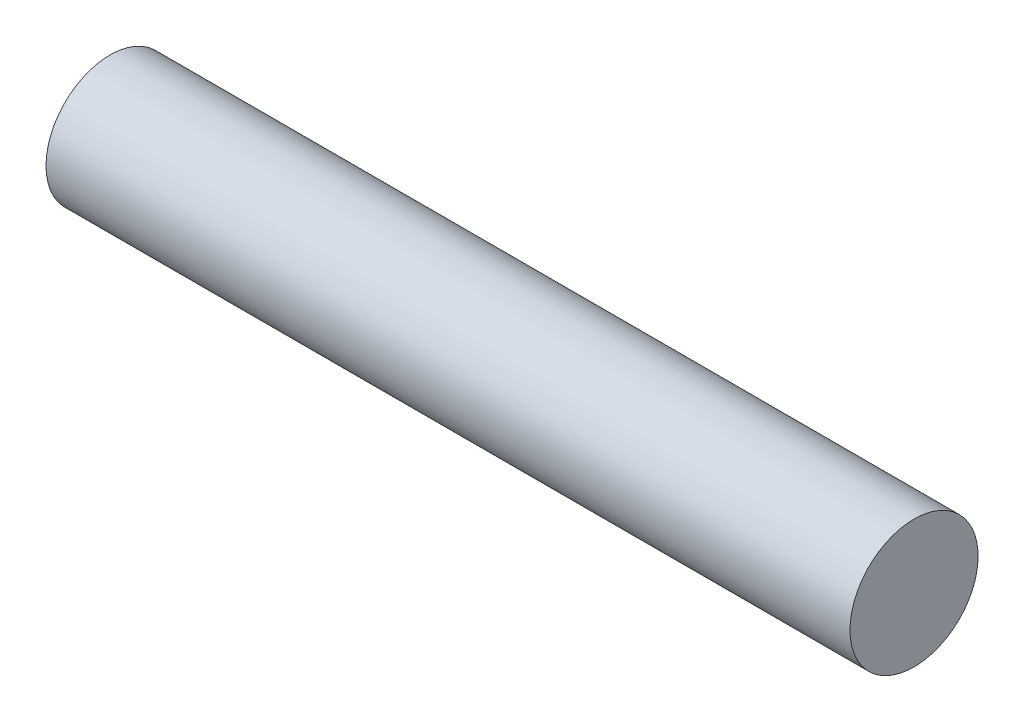
ISO-10303-21;
HEADER;
FILE_DESCRIPTION(('STEP AP214'),'2;1');
FILE_NAME('part.step','',(''),(''),'','','');
FILE_SCHEMA(('AUTOMOTIVE_DESIGN { 1 0 10303 214 1 1 1 1 }'));
ENDSEC;
DATA;
#1=APPLICATION_CONTEXT('core data for automotive mechanical design processes');
#2=APPLICATION_PROTOCOL_DEFINITION('international standard','automotive_design',2000,#1);
#3=PRODUCT_CONTEXT('',#1,'mechanical');
#4=PRODUCT('Part','Part','',(#3));
#5=PRODUCT_RELATED_PRODUCT_CATEGORY('part','',(#4));
#6=PRODUCT_DEFINITION_FORMATION('','',#4);
#7=PRODUCT_DEFINITION_CONTEXT('part definition',#1,'design');
#8=PRODUCT_DEFINITION('design','',#6,#7);
#9=PRODUCT_DEFINITION_SHAPE('','',#8);
#10=(LENGTH_UNIT() NAMED_UNIT(*) SI_UNIT(.MILLI.,.METRE.));
#11=(NAMED_UNIT(*) PLANE_ANGLE_UNIT() SI_UNIT($,.RADIAN.));
#12=(NAMED_UNIT(*) SI_UNIT($,.STERADIAN.) SOLID_ANGLE_UNIT());
#13=UNCERTAINTY_MEASURE_WITH_UNIT(LENGTH_MEASURE(1.E-05),#10,'distance_accuracy_value','');
#14=(GEOMETRIC_REPRESENTATION_CONTEXT(3) GLOBAL_UNCERTAINTY_ASSIGNED_CONTEXT((#13)) GLOBAL_UNIT_ASSIGNED_CONTEXT((#10,
#11,#12)) REPRESENTATION_CONTEXT('',''));
#15=CARTESIAN_POINT('',(0.,0.,0.));
#16=DIRECTION('',(0.,0.,1.));
#17=DIRECTION('',(1.,0.,0.));
#18=AXIS2_PLACEMENT_3D('',#15,#16,#17);
#19=CARTESIAN_POINT('',(0.,0.,-63.7499999999998));
#20=DIRECTION('',(-1.,0.,0.));
#21=DIRECTION('',(0.,0.,1.));
#22=AXIS2_PLACEMENT_3D('',#19,#20,#21);
#23=PLANE('',#22);
#24=CARTESIAN_POINT('',(0.,0.,-63.7499999999998));
#25=DIRECTION('',(-1.,0.,0.));
#26=DIRECTION('',(0.,0.,1.));
#27=AXIS2_PLACEMENT_3D('',#24,#25,#26);
#28=CIRCLE('',#27,63.7499999999998);
#29=CARTESIAN_POINT('',(0.,0.,0.));
#30=VERTEX_POINT('',#29);
#31=EDGE_CURVE('E10',#30,#30,#28,.T.);
#32=ORIENTED_EDGE('',*,*,#31,.T.);
#33=EDGE_LOOP('',(#32));
#34=FACE_BOUND('',#33,.T.);
#35=ADVANCED_FACE('F32',(#34),#23,.T.);
#36=CARTESIAN_POINT('',(800.,0.,-63.7499999999999));
#37=DIRECTION('',(-1.,0.,0.));
#38=DIRECTION('',(0.,0.,1.));
#39=AXIS2_PLACEMENT_3D('',#36,#37,#38);
#40=CYLINDRICAL_SURFACE('',#39,63.7499999999999);
#41=CARTESIAN_POINT('',(800.,0.,-63.7499999999999));
#42=DIRECTION('',(-1.,0.,0.));
#43=DIRECTION('',(0.,0.,1.));
#44=AXIS2_PLACEMENT_3D('',#41,#42,#43);
#45=CIRCLE('',#44,63.7499999999999);
#46=CARTESIAN_POINT('',(800.,0.,0.));
#47=VERTEX_POINT('',#46);
#48=EDGE_CURVE('E38',#47,#47,#45,.T.);
#49=ORIENTED_EDGE('',*,*,#48,.T.);
#50=EDGE_LOOP('',(#49));
#51=FACE_BOUND('',#50,.T.);
#52=ORIENTED_EDGE('',*,*,#31,.F.);
#53=EDGE_LOOP('',(#52));
#54=FACE_BOUND('',#53,.T.);
#55=ADVANCED_FACE('F44',(#51,#54),#40,.T.);
#56=CARTESIAN_POINT('',(800.,0.,0.));
#57=DIRECTION('',(1.,0.,0.));
#58=DIRECTION('',(0.,0.,-1.));
#59=AXIS2_PLACEMENT_3D('',#56,#57,#58);
#60=PLANE('',#59);
#61=ORIENTED_EDGE('',*,*,#48,.F.);
#62=EDGE_LOOP('',(#61));
#63=FACE_BOUND('',#62,.T.);
#64=ADVANCED_FACE('F47',(#63),#60,.T.);
#65=CLOSED_SHELL('',(#35,#55,#64));
#66=MANIFOLD_SOLID_BREP('B2',#65);
#67=ADVANCED_BREP_SHAPE_REPRESENTATION('',(#18,#66),#14);
#68=SHAPE_DEFINITION_REPRESENTATION(#9,#67);
ENDSEC;
END-ISO-10303-21;
